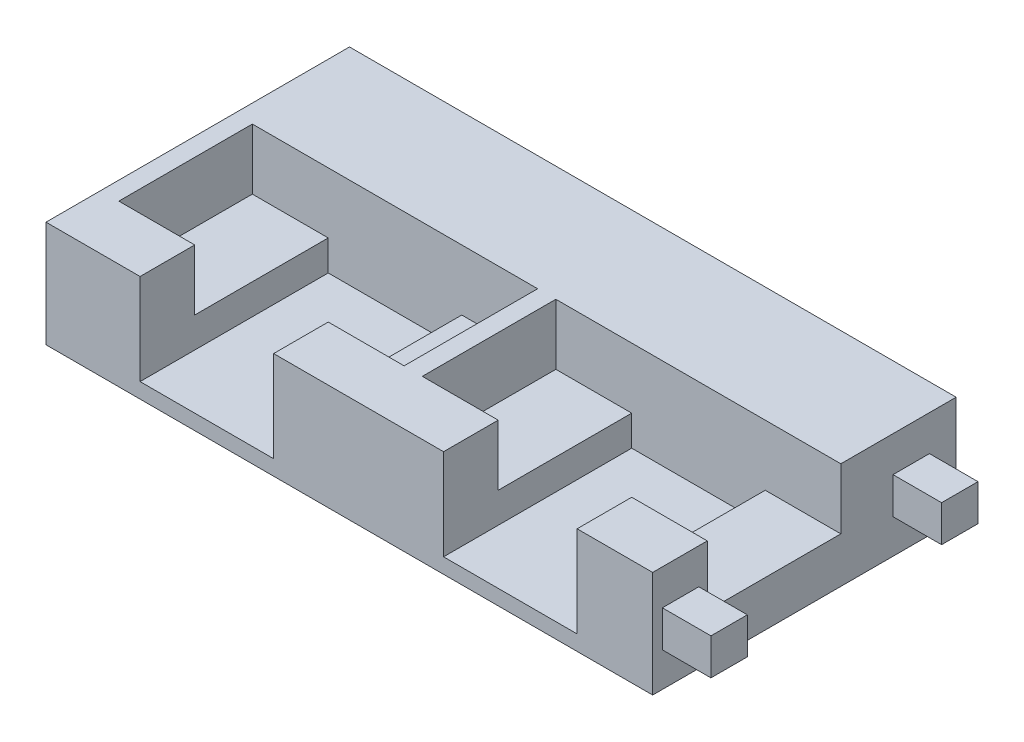
ISO-10303-21;
HEADER;
FILE_DESCRIPTION(('STEP AP214'),'2;1');
FILE_NAME('part.step','',(''),(''),'','','');
FILE_SCHEMA(('AUTOMOTIVE_DESIGN { 1 0 10303 214 1 1 1 1 }'));
ENDSEC;
DATA;
#1=APPLICATION_CONTEXT('core data for automotive mechanical design processes');
#2=APPLICATION_PROTOCOL_DEFINITION('international standard','automotive_design',2000,#1);
#3=PRODUCT_CONTEXT('',#1,'mechanical');
#4=PRODUCT('Part','Part','',(#3));
#5=PRODUCT_RELATED_PRODUCT_CATEGORY('part','',(#4));
#6=PRODUCT_DEFINITION_FORMATION('','',#4);
#7=PRODUCT_DEFINITION_CONTEXT('part definition',#1,'design');
#8=PRODUCT_DEFINITION('design','',#6,#7);
#9=PRODUCT_DEFINITION_SHAPE('','',#8);
#10=(LENGTH_UNIT() NAMED_UNIT(*) SI_UNIT(.MILLI.,.METRE.));
#11=(NAMED_UNIT(*) PLANE_ANGLE_UNIT() SI_UNIT($,.RADIAN.));
#12=(NAMED_UNIT(*) SI_UNIT($,.STERADIAN.) SOLID_ANGLE_UNIT());
#13=UNCERTAINTY_MEASURE_WITH_UNIT(LENGTH_MEASURE(1.E-05),#10,'distance_accuracy_value','');
#14=(GEOMETRIC_REPRESENTATION_CONTEXT(3) GLOBAL_UNCERTAINTY_ASSIGNED_CONTEXT((#13)) GLOBAL_UNIT_ASSIGNED_CONTEXT((#10,
#11,#12)) REPRESENTATION_CONTEXT('',''));
#15=CARTESIAN_POINT('',(0.,0.,0.));
#16=DIRECTION('',(0.,0.,1.));
#17=DIRECTION('',(1.,0.,0.));
#18=AXIS2_PLACEMENT_3D('',#15,#16,#17);
#19=CARTESIAN_POINT('',(108.05,11.75,33.5));
#20=DIRECTION('',(0.,0.,-1.));
#21=DIRECTION('',(-1.,0.,0.));
#22=AXIS2_PLACEMENT_3D('',#19,#20,#21);
#23=PLANE('',#22);
#24=DIRECTION('',(0.,-1.,0.));
#25=VECTOR('',#24,1.);
#26=CARTESIAN_POINT('',(100.05,11.75,33.5));
#27=LINE('',#26,#25);
#28=CARTESIAN_POINT('',(100.05,11.75,33.5));
#29=VERTEX_POINT('',#28);
#30=CARTESIAN_POINT('',(100.05,5.75,33.5));
#31=VERTEX_POINT('',#30);
#32=EDGE_CURVE('E110',#29,#31,#27,.T.);
#33=ORIENTED_EDGE('',*,*,#32,.T.);
#34=DIRECTION('',(-1.,0.,0.));
#35=VECTOR('',#34,1.);
#36=CARTESIAN_POINT('',(108.05,5.75,33.5));
#37=LINE('',#36,#35);
#38=CARTESIAN_POINT('',(108.05,5.75,33.5));
#39=VERTEX_POINT('',#38);
#40=EDGE_CURVE('E12',#39,#31,#37,.T.);
#41=ORIENTED_EDGE('',*,*,#40,.F.);
#42=DIRECTION('',(0.,-1.,0.));
#43=VECTOR('',#42,1.);
#44=CARTESIAN_POINT('',(108.05,11.75,33.5));
#45=LINE('',#44,#43);
#46=CARTESIAN_POINT('',(108.05,11.75,33.5));
#47=VERTEX_POINT('',#46);
#48=EDGE_CURVE('E98',#47,#39,#45,.T.);
#49=ORIENTED_EDGE('',*,*,#48,.F.);
#50=DIRECTION('',(-1.,0.,0.));
#51=VECTOR('',#50,1.);
#52=CARTESIAN_POINT('',(108.05,11.75,33.5));
#53=LINE('',#52,#51);
#54=EDGE_CURVE('E106',#47,#29,#53,.T.);
#55=ORIENTED_EDGE('',*,*,#54,.T.);
#56=EDGE_LOOP('',(#33,#41,#49,#55));
#57=FACE_BOUND('',#56,.T.);
#58=ADVANCED_FACE('F47',(#57),#23,.F.);
#59=CARTESIAN_POINT('',(108.05,5.75,33.5));
#60=DIRECTION('',(0.,1.,0.));
#61=DIRECTION('',(0.,0.,1.));
#62=AXIS2_PLACEMENT_3D('',#59,#60,#61);
#63=PLANE('',#62);
#64=DIRECTION('',(0.,0.,-1.));
#65=VECTOR('',#64,1.);
#66=CARTESIAN_POINT('',(100.05,5.75,33.5));
#67=LINE('',#66,#65);
#68=CARTESIAN_POINT('',(100.05,5.75,27.5));
#69=VERTEX_POINT('',#68);
#70=EDGE_CURVE('E102',#31,#69,#67,.T.);
#71=ORIENTED_EDGE('',*,*,#70,.T.);
#72=DIRECTION('',(-1.,0.,0.));
#73=VECTOR('',#72,1.);
#74=CARTESIAN_POINT('',(108.05,5.75,27.5));
#75=LINE('',#74,#73);
#76=CARTESIAN_POINT('',(108.05,5.75,27.5));
#77=VERTEX_POINT('',#76);
#78=EDGE_CURVE('E55',#77,#69,#75,.T.);
#79=ORIENTED_EDGE('',*,*,#78,.F.);
#80=DIRECTION('',(0.,0.,-1.));
#81=VECTOR('',#80,1.);
#82=CARTESIAN_POINT('',(108.05,5.75,33.5));
#83=LINE('',#82,#81);
#84=EDGE_CURVE('E93',#39,#77,#83,.T.);
#85=ORIENTED_EDGE('',*,*,#84,.F.);
#86=ORIENTED_EDGE('',*,*,#40,.T.);
#87=EDGE_LOOP('',(#71,#79,#85,#86));
#88=FACE_BOUND('',#87,.T.);
#89=ADVANCED_FACE('F101',(#88),#63,.F.);
#90=CARTESIAN_POINT('',(108.05,11.75,27.5));
#91=DIRECTION('',(0.,0.,1.));
#92=DIRECTION('',(1.,0.,0.));
#93=AXIS2_PLACEMENT_3D('',#90,#91,#92);
#94=PLANE('',#93);
#95=DIRECTION('',(0.,1.,0.));
#96=VECTOR('',#95,1.);
#97=CARTESIAN_POINT('',(100.05,11.75,27.5));
#98=LINE('',#97,#96);
#99=CARTESIAN_POINT('',(100.05,11.75,27.5));
#100=VERTEX_POINT('',#99);
#101=EDGE_CURVE('E80',#69,#100,#98,.T.);
#102=ORIENTED_EDGE('',*,*,#101,.T.);
#103=DIRECTION('',(-1.,0.,0.));
#104=VECTOR('',#103,1.);
#105=CARTESIAN_POINT('',(108.05,11.75,27.5));
#106=LINE('',#105,#104);
#107=CARTESIAN_POINT('',(108.05,11.75,27.5));
#108=VERTEX_POINT('',#107);
#109=EDGE_CURVE('E103',#108,#100,#106,.T.);
#110=ORIENTED_EDGE('',*,*,#109,.F.);
#111=DIRECTION('',(0.,1.,0.));
#112=VECTOR('',#111,1.);
#113=CARTESIAN_POINT('',(108.05,11.75,27.5));
#114=LINE('',#113,#112);
#115=EDGE_CURVE('E96',#77,#108,#114,.T.);
#116=ORIENTED_EDGE('',*,*,#115,.F.);
#117=ORIENTED_EDGE('',*,*,#78,.T.);
#118=EDGE_LOOP('',(#102,#110,#116,#117));
#119=FACE_BOUND('',#118,.T.);
#120=ADVANCED_FACE('F104',(#119),#94,.F.);
#121=CARTESIAN_POINT('',(108.05,11.75,33.5));
#122=DIRECTION('',(0.,-1.,0.));
#123=DIRECTION('',(0.,0.,-1.));
#124=AXIS2_PLACEMENT_3D('',#121,#122,#123);
#125=PLANE('',#124);
#126=DIRECTION('',(0.,0.,1.));
#127=VECTOR('',#126,1.);
#128=CARTESIAN_POINT('',(100.05,11.75,33.5));
#129=LINE('',#128,#127);
#130=EDGE_CURVE('E86',#100,#29,#129,.T.);
#131=ORIENTED_EDGE('',*,*,#130,.T.);
#132=ORIENTED_EDGE('',*,*,#54,.F.);
#133=DIRECTION('',(0.,0.,1.));
#134=VECTOR('',#133,1.);
#135=CARTESIAN_POINT('',(108.05,11.75,33.5));
#136=LINE('',#135,#134);
#137=EDGE_CURVE('E63',#108,#47,#136,.T.);
#138=ORIENTED_EDGE('',*,*,#137,.F.);
#139=ORIENTED_EDGE('',*,*,#109,.T.);
#140=EDGE_LOOP('',(#131,#132,#138,#139));
#141=FACE_BOUND('',#140,.T.);
#142=ADVANCED_FACE('F117',(#141),#125,.F.);
#143=CARTESIAN_POINT('',(108.05,0.,0.));
#144=DIRECTION('',(1.,0.,0.));
#145=DIRECTION('',(0.,0.,-1.));
#146=AXIS2_PLACEMENT_3D('',#143,#144,#145);
#147=PLANE('',#146);
#148=ORIENTED_EDGE('',*,*,#48,.T.);
#149=ORIENTED_EDGE('',*,*,#84,.T.);
#150=ORIENTED_EDGE('',*,*,#115,.T.);
#151=ORIENTED_EDGE('',*,*,#137,.T.);
#152=EDGE_LOOP('',(#148,#149,#150,#151));
#153=FACE_BOUND('',#152,.T.);
#154=ADVANCED_FACE('F94',(#153),#147,.T.);
#155=CARTESIAN_POINT('',(100.05,0.,0.));
#156=DIRECTION('',(1.,0.,0.));
#157=DIRECTION('',(0.,0.,-1.));
#158=AXIS2_PLACEMENT_3D('',#155,#156,#157);
#159=PLANE('',#158);
#160=ORIENTED_EDGE('',*,*,#32,.F.);
#161=ORIENTED_EDGE('',*,*,#130,.F.);
#162=ORIENTED_EDGE('',*,*,#101,.F.);
#163=ORIENTED_EDGE('',*,*,#70,.F.);
#164=EDGE_LOOP('',(#160,#161,#162,#163));
#165=FACE_BOUND('',#164,.T.);
#166=ADVANCED_FACE('F120',(#165),#159,.F.);
#167=CLOSED_SHELL('',(#58,#89,#120,#142,#154,#166));
#168=MANIFOLD_SOLID_BREP('B2',#167);
#169=CARTESIAN_POINT('',(108.05,11.75,-4.5));
#170=DIRECTION('',(0.,0.,-1.));
#171=DIRECTION('',(-1.,0.,0.));
#172=AXIS2_PLACEMENT_3D('',#169,#170,#171);
#173=PLANE('',#172);
#174=DIRECTION('',(0.,-1.,0.));
#175=VECTOR('',#174,1.);
#176=CARTESIAN_POINT('',(100.05,11.75,-4.5));
#177=LINE('',#176,#175);
#178=CARTESIAN_POINT('',(100.05,11.75,-4.5));
#179=VERTEX_POINT('',#178);
#180=CARTESIAN_POINT('',(100.05,5.75,-4.5));
#181=VERTEX_POINT('',#180);
#182=EDGE_CURVE('E242',#179,#181,#177,.T.);
#183=ORIENTED_EDGE('',*,*,#182,.T.);
#184=DIRECTION('',(-1.,0.,0.));
#185=VECTOR('',#184,1.);
#186=CARTESIAN_POINT('',(108.05,5.75,-4.5));
#187=LINE('',#186,#185);
#188=CARTESIAN_POINT('',(108.05,5.75,-4.5));
#189=VERTEX_POINT('',#188);
#190=EDGE_CURVE('E45',#189,#181,#187,.T.);
#191=ORIENTED_EDGE('',*,*,#190,.F.);
#192=DIRECTION('',(0.,-1.,0.));
#193=VECTOR('',#192,1.);
#194=CARTESIAN_POINT('',(108.05,11.75,-4.5));
#195=LINE('',#194,#193);
#196=CARTESIAN_POINT('',(108.05,11.75,-4.5));
#197=VERTEX_POINT('',#196);
#198=EDGE_CURVE('E230',#197,#189,#195,.T.);
#199=ORIENTED_EDGE('',*,*,#198,.F.);
#200=DIRECTION('',(-1.,0.,0.));
#201=VECTOR('',#200,1.);
#202=CARTESIAN_POINT('',(108.05,11.75,-4.5));
#203=LINE('',#202,#201);
#204=EDGE_CURVE('E238',#197,#179,#203,.T.);
#205=ORIENTED_EDGE('',*,*,#204,.T.);
#206=EDGE_LOOP('',(#183,#191,#199,#205));
#207=FACE_BOUND('',#206,.T.);
#208=ADVANCED_FACE('F179',(#207),#173,.F.);
#209=CARTESIAN_POINT('',(108.05,5.75,-4.5));
#210=DIRECTION('',(0.,1.,0.));
#211=DIRECTION('',(0.,0.,1.));
#212=AXIS2_PLACEMENT_3D('',#209,#210,#211);
#213=PLANE('',#212);
#214=DIRECTION('',(0.,0.,-1.));
#215=VECTOR('',#214,1.);
#216=CARTESIAN_POINT('',(100.05,5.75,-4.5));
#217=LINE('',#216,#215);
#218=CARTESIAN_POINT('',(100.05,5.75,-10.5));
#219=VERTEX_POINT('',#218);
#220=EDGE_CURVE('E234',#181,#219,#217,.T.);
#221=ORIENTED_EDGE('',*,*,#220,.T.);
#222=DIRECTION('',(-1.,0.,0.));
#223=VECTOR('',#222,1.);
#224=CARTESIAN_POINT('',(108.05,5.75,-10.5));
#225=LINE('',#224,#223);
#226=CARTESIAN_POINT('',(108.05,5.75,-10.5));
#227=VERTEX_POINT('',#226);
#228=EDGE_CURVE('E187',#227,#219,#225,.T.);
#229=ORIENTED_EDGE('',*,*,#228,.F.);
#230=DIRECTION('',(0.,0.,-1.));
#231=VECTOR('',#230,1.);
#232=CARTESIAN_POINT('',(108.05,5.75,-4.5));
#233=LINE('',#232,#231);
#234=EDGE_CURVE('E225',#189,#227,#233,.T.);
#235=ORIENTED_EDGE('',*,*,#234,.F.);
#236=ORIENTED_EDGE('',*,*,#190,.T.);
#237=EDGE_LOOP('',(#221,#229,#235,#236));
#238=FACE_BOUND('',#237,.T.);
#239=ADVANCED_FACE('F233',(#238),#213,.F.);
#240=CARTESIAN_POINT('',(108.05,11.75,-10.5));
#241=DIRECTION('',(0.,0.,1.));
#242=DIRECTION('',(1.,0.,0.));
#243=AXIS2_PLACEMENT_3D('',#240,#241,#242);
#244=PLANE('',#243);
#245=DIRECTION('',(0.,1.,0.));
#246=VECTOR('',#245,1.);
#247=CARTESIAN_POINT('',(100.05,11.75,-10.5));
#248=LINE('',#247,#246);
#249=CARTESIAN_POINT('',(100.05,11.75,-10.5));
#250=VERTEX_POINT('',#249);
#251=EDGE_CURVE('E212',#219,#250,#248,.T.);
#252=ORIENTED_EDGE('',*,*,#251,.T.);
#253=DIRECTION('',(-1.,0.,0.));
#254=VECTOR('',#253,1.);
#255=CARTESIAN_POINT('',(108.05,11.75,-10.5));
#256=LINE('',#255,#254);
#257=CARTESIAN_POINT('',(108.05,11.75,-10.5));
#258=VERTEX_POINT('',#257);
#259=EDGE_CURVE('E235',#258,#250,#256,.T.);
#260=ORIENTED_EDGE('',*,*,#259,.F.);
#261=DIRECTION('',(0.,1.,0.));
#262=VECTOR('',#261,1.);
#263=CARTESIAN_POINT('',(108.05,11.75,-10.5));
#264=LINE('',#263,#262);
#265=EDGE_CURVE('E228',#227,#258,#264,.T.);
#266=ORIENTED_EDGE('',*,*,#265,.F.);
#267=ORIENTED_EDGE('',*,*,#228,.T.);
#268=EDGE_LOOP('',(#252,#260,#266,#267));
#269=FACE_BOUND('',#268,.T.);
#270=ADVANCED_FACE('F236',(#269),#244,.F.);
#271=CARTESIAN_POINT('',(108.05,11.75,-4.5));
#272=DIRECTION('',(0.,-1.,0.));
#273=DIRECTION('',(0.,0.,-1.));
#274=AXIS2_PLACEMENT_3D('',#271,#272,#273);
#275=PLANE('',#274);
#276=DIRECTION('',(0.,0.,1.));
#277=VECTOR('',#276,1.);
#278=CARTESIAN_POINT('',(100.05,11.75,-4.5));
#279=LINE('',#278,#277);
#280=EDGE_CURVE('E218',#250,#179,#279,.T.);
#281=ORIENTED_EDGE('',*,*,#280,.T.);
#282=ORIENTED_EDGE('',*,*,#204,.F.);
#283=DIRECTION('',(0.,0.,1.));
#284=VECTOR('',#283,1.);
#285=CARTESIAN_POINT('',(108.05,11.75,-4.5));
#286=LINE('',#285,#284);
#287=EDGE_CURVE('E195',#258,#197,#286,.T.);
#288=ORIENTED_EDGE('',*,*,#287,.F.);
#289=ORIENTED_EDGE('',*,*,#259,.T.);
#290=EDGE_LOOP('',(#281,#282,#288,#289));
#291=FACE_BOUND('',#290,.T.);
#292=ADVANCED_FACE('F249',(#291),#275,.F.);
#293=CARTESIAN_POINT('',(108.05,0.,0.));
#294=DIRECTION('',(1.,0.,0.));
#295=DIRECTION('',(0.,0.,-1.));
#296=AXIS2_PLACEMENT_3D('',#293,#294,#295);
#297=PLANE('',#296);
#298=ORIENTED_EDGE('',*,*,#198,.T.);
#299=ORIENTED_EDGE('',*,*,#234,.T.);
#300=ORIENTED_EDGE('',*,*,#265,.T.);
#301=ORIENTED_EDGE('',*,*,#287,.T.);
#302=EDGE_LOOP('',(#298,#299,#300,#301));
#303=FACE_BOUND('',#302,.T.);
#304=ADVANCED_FACE('F226',(#303),#297,.T.);
#305=CARTESIAN_POINT('',(100.05,0.,0.));
#306=DIRECTION('',(1.,0.,0.));
#307=DIRECTION('',(0.,0.,-1.));
#308=AXIS2_PLACEMENT_3D('',#305,#306,#307);
#309=PLANE('',#308);
#310=ORIENTED_EDGE('',*,*,#182,.F.);
#311=ORIENTED_EDGE('',*,*,#280,.F.);
#312=ORIENTED_EDGE('',*,*,#251,.F.);
#313=ORIENTED_EDGE('',*,*,#220,.F.);
#314=EDGE_LOOP('',(#310,#311,#312,#313));
#315=FACE_BOUND('',#314,.T.);
#316=ADVANCED_FACE('F252',(#315),#309,.F.);
#317=CLOSED_SHELL('',(#208,#239,#270,#292,#304,#316));
#318=MANIFOLD_SOLID_BREP('B6',#317);
#319=CARTESIAN_POINT('',(0.,17.5,-15.));
#320=DIRECTION('',(0.,0.,-1.));
#321=DIRECTION('',(-1.,0.,0.));
#322=AXIS2_PLACEMENT_3D('',#319,#320,#321);
#323=PLANE('',#322);
#324=DIRECTION('',(1.,0.,0.));
#325=VECTOR('',#324,1.);
#326=CARTESIAN_POINT('',(0.,17.5,-15.));
#327=LINE('',#326,#325);
#328=CARTESIAN_POINT('',(0.,17.5,-15.));
#329=VERTEX_POINT('',#328);
#330=CARTESIAN_POINT('',(99.95,17.5,-15.));
#331=VERTEX_POINT('',#330);
#332=EDGE_CURVE('E380',#329,#331,#327,.T.);
#333=ORIENTED_EDGE('',*,*,#332,.T.);
#334=DIRECTION('',(0.,1.,0.));
#335=VECTOR('',#334,1.);
#336=CARTESIAN_POINT('',(99.95,18.,-15.));
#337=LINE('',#336,#335);
#338=CARTESIAN_POINT('',(99.95,0.,-15.));
#339=VERTEX_POINT('',#338);
#340=EDGE_CURVE('E688',#339,#331,#337,.T.);
#341=ORIENTED_EDGE('',*,*,#340,.F.);
#342=DIRECTION('',(1.,0.,0.));
#343=VECTOR('',#342,1.);
#344=CARTESIAN_POINT('',(0.,0.,-15.));
#345=LINE('',#344,#343);
#346=CARTESIAN_POINT('',(0.,0.,-15.));
#347=VERTEX_POINT('',#346);
#348=EDGE_CURVE('E389',#347,#339,#345,.T.);
#349=ORIENTED_EDGE('',*,*,#348,.F.);
#350=DIRECTION('',(0.,-1.,0.));
#351=VECTOR('',#350,1.);
#352=CARTESIAN_POINT('',(0.,17.5,-15.));
#353=LINE('',#352,#351);
#354=EDGE_CURVE('E384',#329,#347,#353,.T.);
#355=ORIENTED_EDGE('',*,*,#354,.F.);
#356=EDGE_LOOP('',(#333,#341,#349,#355));
#357=FACE_BOUND('',#356,.T.);
#358=ADVANCED_FACE('F302',(#357),#323,.T.);
#359=CARTESIAN_POINT('',(0.,0.,0.));
#360=DIRECTION('',(0.,1.,0.));
#361=DIRECTION('',(0.,0.,1.));
#362=AXIS2_PLACEMENT_3D('',#359,#360,#361);
#363=PLANE('',#362);
#364=DIRECTION('',(0.,0.,-1.));
#365=VECTOR('',#364,1.);
#366=CARTESIAN_POINT('',(99.95,0.,35.));
#367=LINE('',#366,#365);
#368=CARTESIAN_POINT('',(99.95,0.,35.));
#369=VERTEX_POINT('',#368);
#370=EDGE_CURVE('E690',#369,#339,#367,.T.);
#371=ORIENTED_EDGE('',*,*,#370,.F.);
#372=DIRECTION('',(1.,0.,0.));
#373=VECTOR('',#372,1.);
#374=CARTESIAN_POINT('',(0.,0.,35.));
#375=LINE('',#374,#373);
#376=CARTESIAN_POINT('',(0.,0.,35.));
#377=VERTEX_POINT('',#376);
#378=EDGE_CURVE('E391',#377,#369,#375,.T.);
#379=ORIENTED_EDGE('',*,*,#378,.F.);
#380=DIRECTION('',(0.,0.,1.));
#381=VECTOR('',#380,1.);
#382=CARTESIAN_POINT('',(0.,0.,-15.));
#383=LINE('',#382,#381);
#384=EDGE_CURVE('E394',#347,#377,#383,.T.);
#385=ORIENTED_EDGE('',*,*,#384,.F.);
#386=ORIENTED_EDGE('',*,*,#348,.T.);
#387=EDGE_LOOP('',(#371,#379,#385,#386));
#388=FACE_BOUND('',#387,.T.);
#389=ADVANCED_FACE('F304',(#388),#363,.F.);
#390=CARTESIAN_POINT('',(0.,17.5,35.));
#391=DIRECTION('',(0.,0.,-1.));
#392=DIRECTION('',(-1.,0.,0.));
#393=AXIS2_PLACEMENT_3D('',#390,#391,#392);
#394=PLANE('',#393);
#395=DIRECTION('',(0.,-1.,0.));
#396=VECTOR('',#395,1.);
#397=CARTESIAN_POINT('',(99.95,17.5,35.));
#398=LINE('',#397,#396);
#399=CARTESIAN_POINT('',(99.95,17.5,35.));
#400=VERTEX_POINT('',#399);
#401=EDGE_CURVE('E177',#400,#369,#398,.T.);
#402=ORIENTED_EDGE('',*,*,#401,.F.);
#403=DIRECTION('',(1.,0.,0.));
#404=VECTOR('',#403,1.);
#405=CARTESIAN_POINT('',(0.,17.5,35.));
#406=LINE('',#405,#404);
#407=CARTESIAN_POINT('',(87.5,17.5,35.));
#408=VERTEX_POINT('',#407);
#409=EDGE_CURVE('E388',#408,#400,#406,.T.);
#410=ORIENTED_EDGE('',*,*,#409,.F.);
#411=DIRECTION('',(0.,1.,0.));
#412=VECTOR('',#411,1.);
#413=CARTESIAN_POINT('',(87.5,2.5,35.));
#414=LINE('',#413,#412);
#415=CARTESIAN_POINT('',(87.5,2.5,35.));
#416=VERTEX_POINT('',#415);
#417=EDGE_CURVE('E518',#416,#408,#414,.T.);
#418=ORIENTED_EDGE('',*,*,#417,.F.);
#419=DIRECTION('',(-1.,0.,0.));
#420=VECTOR('',#419,1.);
#421=CARTESIAN_POINT('',(87.5,2.5,35.));
#422=LINE('',#421,#420);
#423=CARTESIAN_POINT('',(65.5,2.5,35.));
#424=VERTEX_POINT('',#423);
#425=EDGE_CURVE('E362',#416,#424,#422,.T.);
#426=ORIENTED_EDGE('',*,*,#425,.T.);
#427=DIRECTION('',(0.,1.,0.));
#428=VECTOR('',#427,1.);
#429=CARTESIAN_POINT('',(65.5,2.5,35.));
#430=LINE('',#429,#428);
#431=CARTESIAN_POINT('',(65.5,17.5,35.));
#432=VERTEX_POINT('',#431);
#433=EDGE_CURVE('E521',#424,#432,#430,.T.);
#434=ORIENTED_EDGE('',*,*,#433,.T.);
#435=CARTESIAN_POINT('',(37.5,17.5,35.));
#436=VERTEX_POINT('',#435);
#437=EDGE_CURVE('E387',#436,#432,#406,.T.);
#438=ORIENTED_EDGE('',*,*,#437,.F.);
#439=DIRECTION('',(0.,1.,0.));
#440=VECTOR('',#439,1.);
#441=CARTESIAN_POINT('',(37.5,2.5,35.));
#442=LINE('',#441,#440);
#443=CARTESIAN_POINT('',(37.5,2.5,35.));
#444=VERTEX_POINT('',#443);
#445=EDGE_CURVE('E462',#444,#436,#442,.T.);
#446=ORIENTED_EDGE('',*,*,#445,.F.);
#447=DIRECTION('',(1.,0.,0.));
#448=VECTOR('',#447,1.);
#449=CARTESIAN_POINT('',(15.5,2.5,35.));
#450=LINE('',#449,#448);
#451=CARTESIAN_POINT('',(15.5,2.5,35.));
#452=VERTEX_POINT('',#451);
#453=EDGE_CURVE('E483',#452,#444,#450,.T.);
#454=ORIENTED_EDGE('',*,*,#453,.F.);
#455=DIRECTION('',(0.,1.,0.));
#456=VECTOR('',#455,1.);
#457=CARTESIAN_POINT('',(15.5,2.5,35.));
#458=LINE('',#457,#456);
#459=CARTESIAN_POINT('',(15.5,17.5,35.));
#460=VERTEX_POINT('',#459);
#461=EDGE_CURVE('E458',#452,#460,#458,.T.);
#462=ORIENTED_EDGE('',*,*,#461,.T.);
#463=CARTESIAN_POINT('',(0.,17.5,35.));
#464=VERTEX_POINT('',#463);
#465=EDGE_CURVE('E383',#464,#460,#406,.T.);
#466=ORIENTED_EDGE('',*,*,#465,.F.);
#467=DIRECTION('',(0.,-1.,0.));
#468=VECTOR('',#467,1.);
#469=CARTESIAN_POINT('',(0.,17.5,35.));
#470=LINE('',#469,#468);
#471=EDGE_CURVE('E679',#464,#377,#470,.T.);
#472=ORIENTED_EDGE('',*,*,#471,.T.);
#473=ORIENTED_EDGE('',*,*,#378,.T.);
#474=EDGE_LOOP('',(#402,#410,#418,#426,#434,#438,#446,#454,#462,#466,#472,#473));
#475=FACE_BOUND('',#474,.T.);
#476=ADVANCED_FACE('F526',(#475),#394,.F.);
#477=CARTESIAN_POINT('',(0.,7.5,0.));
#478=DIRECTION('',(0.,1.,0.));
#479=DIRECTION('',(0.,0.,1.));
#480=AXIS2_PLACEMENT_3D('',#477,#478,#479);
#481=PLANE('',#480);
#482=DIRECTION('',(0.,0.,1.));
#483=VECTOR('',#482,1.);
#484=CARTESIAN_POINT('',(15.5,7.5,0.));
#485=LINE('',#484,#483);
#486=CARTESIAN_POINT('',(15.5,7.5,4.));
#487=VERTEX_POINT('',#486);
#488=CARTESIAN_POINT('',(15.5,7.5,26.));
#489=VERTEX_POINT('',#488);
#490=EDGE_CURVE('E648',#487,#489,#485,.T.);
#491=ORIENTED_EDGE('',*,*,#490,.F.);
#492=DIRECTION('',(-1.,0.,0.));
#493=VECTOR('',#492,1.);
#494=CARTESIAN_POINT('',(3.,7.5,4.));
#495=LINE('',#494,#493);
#496=CARTESIAN_POINT('',(3.,7.5,4.));
#497=VERTEX_POINT('',#496);
#498=EDGE_CURVE('E442',#487,#497,#495,.T.);
#499=ORIENTED_EDGE('',*,*,#498,.T.);
#500=DIRECTION('',(0.,0.,1.));
#501=VECTOR('',#500,1.);
#502=CARTESIAN_POINT('',(3.,7.5,4.));
#503=LINE('',#502,#501);
#504=CARTESIAN_POINT('',(3.,7.5,26.));
#505=VERTEX_POINT('',#504);
#506=EDGE_CURVE('E429',#497,#505,#503,.T.);
#507=ORIENTED_EDGE('',*,*,#506,.T.);
#508=DIRECTION('',(1.,0.,0.));
#509=VECTOR('',#508,1.);
#510=CARTESIAN_POINT('',(3.,7.5,26.));
#511=LINE('',#510,#509);
#512=EDGE_CURVE('E446',#505,#489,#511,.T.);
#513=ORIENTED_EDGE('',*,*,#512,.T.);
#514=EDGE_LOOP('',(#491,#499,#507,#513));
#515=FACE_BOUND('',#514,.T.);
#516=ADVANCED_FACE('F704',(#515),#481,.T.);
#517=DIRECTION('',(0.,0.,-1.));
#518=VECTOR('',#517,1.);
#519=CARTESIAN_POINT('',(37.5,7.5,0.));
#520=LINE('',#519,#518);
#521=CARTESIAN_POINT('',(37.5,7.5,26.));
#522=VERTEX_POINT('',#521);
#523=CARTESIAN_POINT('',(37.5,7.5,4.));
#524=VERTEX_POINT('',#523);
#525=EDGE_CURVE('E681',#522,#524,#520,.T.);
#526=ORIENTED_EDGE('',*,*,#525,.F.);
#527=CARTESIAN_POINT('',(50.,7.5,26.));
#528=VERTEX_POINT('',#527);
#529=EDGE_CURVE('E449',#522,#528,#511,.T.);
#530=ORIENTED_EDGE('',*,*,#529,.T.);
#531=DIRECTION('',(0.,0.,-1.));
#532=VECTOR('',#531,1.);
#533=CARTESIAN_POINT('',(50.,7.5,4.));
#534=LINE('',#533,#532);
#535=CARTESIAN_POINT('',(50.,7.5,4.));
#536=VERTEX_POINT('',#535);
#537=EDGE_CURVE('E443',#528,#536,#534,.T.);
#538=ORIENTED_EDGE('',*,*,#537,.T.);
#539=EDGE_CURVE('E419',#536,#524,#495,.T.);
#540=ORIENTED_EDGE('',*,*,#539,.T.);
#541=EDGE_LOOP('',(#526,#530,#538,#540));
#542=FACE_BOUND('',#541,.T.);
#543=ADVANCED_FACE('F726',(#542),#481,.T.);
#544=CARTESIAN_POINT('',(53.,7.5,4.));
#545=DIRECTION('',(1.,0.,0.));
#546=DIRECTION('',(0.,0.,-1.));
#547=AXIS2_PLACEMENT_3D('',#544,#545,#546);
#548=PLANE('',#547);
#549=DIRECTION('',(0.,0.,-1.));
#550=VECTOR('',#549,1.);
#551=CARTESIAN_POINT('',(53.,17.5,4.));
#552=LINE('',#551,#550);
#553=CARTESIAN_POINT('',(53.,17.5,26.));
#554=VERTEX_POINT('',#553);
#555=CARTESIAN_POINT('',(53.,17.5,4.));
#556=VERTEX_POINT('',#555);
#557=EDGE_CURVE('E499',#554,#556,#552,.T.);
#558=ORIENTED_EDGE('',*,*,#557,.F.);
#559=DIRECTION('',(0.,1.,0.));
#560=VECTOR('',#559,1.);
#561=CARTESIAN_POINT('',(53.,7.5,26.));
#562=LINE('',#561,#560);
#563=CARTESIAN_POINT('',(53.,7.5,26.));
#564=VERTEX_POINT('',#563);
#565=EDGE_CURVE('E477',#564,#554,#562,.T.);
#566=ORIENTED_EDGE('',*,*,#565,.F.);
#567=DIRECTION('',(0.,0.,-1.));
#568=VECTOR('',#567,1.);
#569=CARTESIAN_POINT('',(53.,7.5,4.));
#570=LINE('',#569,#568);
#571=CARTESIAN_POINT('',(53.,7.5,4.));
#572=VERTEX_POINT('',#571);
#573=EDGE_CURVE('E509',#564,#572,#570,.T.);
#574=ORIENTED_EDGE('',*,*,#573,.T.);
#575=DIRECTION('',(0.,1.,0.));
#576=VECTOR('',#575,1.);
#577=CARTESIAN_POINT('',(53.,7.5,4.));
#578=LINE('',#577,#576);
#579=EDGE_CURVE('E488',#572,#556,#578,.T.);
#580=ORIENTED_EDGE('',*,*,#579,.T.);
#581=EDGE_LOOP('',(#558,#566,#574,#580));
#582=FACE_BOUND('',#581,.T.);
#583=ADVANCED_FACE('F654',(#582),#548,.T.);
#584=CARTESIAN_POINT('',(3.,7.5,26.));
#585=DIRECTION('',(0.,0.,1.));
#586=DIRECTION('',(1.,0.,0.));
#587=AXIS2_PLACEMENT_3D('',#584,#585,#586);
#588=PLANE('',#587);
#589=ORIENTED_EDGE('',*,*,#529,.F.);
#590=DIRECTION('',(0.,1.,0.));
#591=VECTOR('',#590,1.);
#592=CARTESIAN_POINT('',(37.5,7.5,26.));
#593=LINE('',#592,#591);
#594=CARTESIAN_POINT('',(37.5,17.5,26.));
#595=VERTEX_POINT('',#594);
#596=EDGE_CURVE('E454',#522,#595,#593,.T.);
#597=ORIENTED_EDGE('',*,*,#596,.T.);
#598=DIRECTION('',(1.,0.,0.));
#599=VECTOR('',#598,1.);
#600=CARTESIAN_POINT('',(3.,17.5,26.));
#601=LINE('',#600,#599);
#602=CARTESIAN_POINT('',(50.,17.5,26.));
#603=VERTEX_POINT('',#602);
#604=EDGE_CURVE('E435',#595,#603,#601,.T.);
#605=ORIENTED_EDGE('',*,*,#604,.T.);
#606=DIRECTION('',(0.,1.,0.));
#607=VECTOR('',#606,1.);
#608=CARTESIAN_POINT('',(50.,7.5,26.));
#609=LINE('',#608,#607);
#610=EDGE_CURVE('E420',#528,#603,#609,.T.);
#611=ORIENTED_EDGE('',*,*,#610,.F.);
#612=EDGE_LOOP('',(#589,#597,#605,#611));
#613=FACE_BOUND('',#612,.T.);
#614=ADVANCED_FACE('F725',(#613),#588,.F.);
#615=CARTESIAN_POINT('',(50.,7.5,4.));
#616=DIRECTION('',(1.,0.,0.));
#617=DIRECTION('',(0.,0.,-1.));
#618=AXIS2_PLACEMENT_3D('',#615,#616,#617);
#619=PLANE('',#618);
#620=DIRECTION('',(0.,0.,-1.));
#621=VECTOR('',#620,1.);
#622=CARTESIAN_POINT('',(50.,17.5,4.));
#623=LINE('',#622,#621);
#624=CARTESIAN_POINT('',(50.,17.5,4.));
#625=VERTEX_POINT('',#624);
#626=EDGE_CURVE('E428',#603,#625,#623,.T.);
#627=ORIENTED_EDGE('',*,*,#626,.T.);
#628=DIRECTION('',(0.,1.,0.));
#629=VECTOR('',#628,1.);
#630=CARTESIAN_POINT('',(50.,7.5,4.));
#631=LINE('',#630,#629);
#632=EDGE_CURVE('E409',#536,#625,#631,.T.);
#633=ORIENTED_EDGE('',*,*,#632,.F.);
#634=ORIENTED_EDGE('',*,*,#537,.F.);
#635=ORIENTED_EDGE('',*,*,#610,.T.);
#636=EDGE_LOOP('',(#627,#633,#634,#635));
#637=FACE_BOUND('',#636,.T.);
#638=ADVANCED_FACE('F742',(#637),#619,.F.);
#639=CARTESIAN_POINT('',(3.,7.5,4.));
#640=DIRECTION('',(0.,0.,-1.));
#641=DIRECTION('',(-1.,0.,0.));
#642=AXIS2_PLACEMENT_3D('',#639,#640,#641);
#643=PLANE('',#642);
#644=DIRECTION('',(-1.,0.,0.));
#645=VECTOR('',#644,1.);
#646=CARTESIAN_POINT('',(3.,17.5,4.));
#647=LINE('',#646,#645);
#648=CARTESIAN_POINT('',(3.,17.5,4.));
#649=VERTEX_POINT('',#648);
#650=EDGE_CURVE('E425',#625,#649,#647,.T.);
#651=ORIENTED_EDGE('',*,*,#650,.T.);
#652=DIRECTION('',(0.,1.,0.));
#653=VECTOR('',#652,1.);
#654=CARTESIAN_POINT('',(3.,7.5,4.));
#655=LINE('',#654,#653);
#656=EDGE_CURVE('E401',#497,#649,#655,.T.);
#657=ORIENTED_EDGE('',*,*,#656,.F.);
#658=ORIENTED_EDGE('',*,*,#498,.F.);
#659=DIRECTION('',(0.,1.,0.));
#660=VECTOR('',#659,1.);
#661=CARTESIAN_POINT('',(15.5,2.5,4.));
#662=LINE('',#661,#660);
#663=CARTESIAN_POINT('',(15.5,2.5,4.));
#664=VERTEX_POINT('',#663);
#665=EDGE_CURVE('E457',#664,#487,#662,.T.);
#666=ORIENTED_EDGE('',*,*,#665,.F.);
#667=DIRECTION('',(-1.,0.,0.));
#668=VECTOR('',#667,1.);
#669=CARTESIAN_POINT('',(15.5,2.5,4.));
#670=LINE('',#669,#668);
#671=CARTESIAN_POINT('',(37.5,2.5,4.));
#672=VERTEX_POINT('',#671);
#673=EDGE_CURVE('E461',#672,#664,#670,.T.);
#674=ORIENTED_EDGE('',*,*,#673,.F.);
#675=DIRECTION('',(0.,1.,0.));
#676=VECTOR('',#675,1.);
#677=CARTESIAN_POINT('',(37.5,2.5,4.));
#678=LINE('',#677,#676);
#679=EDGE_CURVE('E465',#672,#524,#678,.T.);
#680=ORIENTED_EDGE('',*,*,#679,.T.);
#681=ORIENTED_EDGE('',*,*,#539,.F.);
#682=ORIENTED_EDGE('',*,*,#632,.T.);
#683=EDGE_LOOP('',(#651,#657,#658,#666,#674,#680,#681,#682));
#684=FACE_BOUND('',#683,.T.);
#685=ADVANCED_FACE('F738',(#684),#643,.F.);
#686=CARTESIAN_POINT('',(3.,7.5,4.));
#687=DIRECTION('',(-1.,0.,0.));
#688=DIRECTION('',(0.,0.,1.));
#689=AXIS2_PLACEMENT_3D('',#686,#687,#688);
#690=PLANE('',#689);
#691=DIRECTION('',(0.,0.,1.));
#692=VECTOR('',#691,1.);
#693=CARTESIAN_POINT('',(3.,17.5,4.));
#694=LINE('',#693,#692);
#695=CARTESIAN_POINT('',(3.,17.5,26.));
#696=VERTEX_POINT('',#695);
#697=EDGE_CURVE('E436',#649,#696,#694,.T.);
#698=ORIENTED_EDGE('',*,*,#697,.T.);
#699=DIRECTION('',(0.,1.,0.));
#700=VECTOR('',#699,1.);
#701=CARTESIAN_POINT('',(3.,7.5,26.));
#702=LINE('',#701,#700);
#703=EDGE_CURVE('E416',#505,#696,#702,.T.);
#704=ORIENTED_EDGE('',*,*,#703,.F.);
#705=ORIENTED_EDGE('',*,*,#506,.F.);
#706=ORIENTED_EDGE('',*,*,#656,.T.);
#707=EDGE_LOOP('',(#698,#704,#705,#706));
#708=FACE_BOUND('',#707,.T.);
#709=ADVANCED_FACE('F741',(#708),#690,.F.);
#710=CARTESIAN_POINT('',(15.5,17.5,26.));
#711=VERTEX_POINT('',#710);
#712=EDGE_CURVE('E432',#696,#711,#601,.T.);
#713=ORIENTED_EDGE('',*,*,#712,.T.);
#714=DIRECTION('',(0.,-1.,0.));
#715=VECTOR('',#714,1.);
#716=CARTESIAN_POINT('',(15.5,7.5,26.));
#717=LINE('',#716,#715);
#718=EDGE_CURVE('E439',#711,#489,#717,.T.);
#719=ORIENTED_EDGE('',*,*,#718,.T.);
#720=ORIENTED_EDGE('',*,*,#512,.F.);
#721=ORIENTED_EDGE('',*,*,#703,.T.);
#722=EDGE_LOOP('',(#713,#719,#720,#721));
#723=FACE_BOUND('',#722,.T.);
#724=ADVANCED_FACE('F750',(#723),#588,.F.);
#725=CARTESIAN_POINT('',(100.,7.5,26.));
#726=DIRECTION('',(0.,0.,-1.));
#727=DIRECTION('',(-1.,0.,0.));
#728=AXIS2_PLACEMENT_3D('',#725,#726,#727);
#729=PLANE('',#728);
#730=DIRECTION('',(-1.,0.,0.));
#731=VECTOR('',#730,1.);
#732=CARTESIAN_POINT('',(100.,17.5,26.));
#733=LINE('',#732,#731);
#734=CARTESIAN_POINT('',(65.5,17.5,26.));
#735=VERTEX_POINT('',#734);
#736=EDGE_CURVE('E497',#735,#554,#733,.T.);
#737=ORIENTED_EDGE('',*,*,#736,.F.);
#738=DIRECTION('',(0.,-1.,0.));
#739=VECTOR('',#738,1.);
#740=CARTESIAN_POINT('',(65.5,7.5,26.));
#741=LINE('',#740,#739);
#742=CARTESIAN_POINT('',(65.5,7.5,26.));
#743=VERTEX_POINT('',#742);
#744=EDGE_CURVE('E516',#735,#743,#741,.T.);
#745=ORIENTED_EDGE('',*,*,#744,.T.);
#746=DIRECTION('',(-1.,0.,0.));
#747=VECTOR('',#746,1.);
#748=CARTESIAN_POINT('',(100.,7.5,26.));
#749=LINE('',#748,#747);
#750=EDGE_CURVE('E508',#743,#564,#749,.T.);
#751=ORIENTED_EDGE('',*,*,#750,.T.);
#752=ORIENTED_EDGE('',*,*,#565,.T.);
#753=EDGE_LOOP('',(#737,#745,#751,#752));
#754=FACE_BOUND('',#753,.T.);
#755=ADVANCED_FACE('F658',(#754),#729,.T.);
#756=CARTESIAN_POINT('',(103.,7.5,0.));
#757=DIRECTION('',(0.,1.,0.));
#758=DIRECTION('',(0.,0.,1.));
#759=AXIS2_PLACEMENT_3D('',#756,#757,#758);
#760=PLANE('',#759);
#761=ORIENTED_EDGE('',*,*,#750,.F.);
#762=DIRECTION('',(0.,0.,-1.));
#763=VECTOR('',#762,1.);
#764=CARTESIAN_POINT('',(65.5,7.5,0.));
#765=LINE('',#764,#763);
#766=CARTESIAN_POINT('',(65.5,7.5,4.));
#767=VERTEX_POINT('',#766);
#768=EDGE_CURVE('E642',#743,#767,#765,.T.);
#769=ORIENTED_EDGE('',*,*,#768,.T.);
#770=DIRECTION('',(1.,0.,0.));
#771=VECTOR('',#770,1.);
#772=CARTESIAN_POINT('',(100.,7.5,3.99999999999999));
#773=LINE('',#772,#771);
#774=EDGE_CURVE('E512',#572,#767,#773,.T.);
#775=ORIENTED_EDGE('',*,*,#774,.F.);
#776=ORIENTED_EDGE('',*,*,#573,.F.);
#777=EDGE_LOOP('',(#761,#769,#775,#776));
#778=FACE_BOUND('',#777,.T.);
#779=ADVANCED_FACE('F646',(#778),#760,.T.);
#780=DIRECTION('',(0.,1.,0.));
#781=VECTOR('',#780,1.);
#782=CARTESIAN_POINT('',(99.95,7.5,26.));
#783=LINE('',#782,#781);
#784=CARTESIAN_POINT('',(99.95,7.5,26.));
#785=VERTEX_POINT('',#784);
#786=CARTESIAN_POINT('',(99.95,17.5,26.));
#787=VERTEX_POINT('',#786);
#788=EDGE_CURVE('E374',#785,#787,#783,.T.);
#789=ORIENTED_EDGE('',*,*,#788,.F.);
#790=CARTESIAN_POINT('',(87.5,7.5,26.));
#791=VERTEX_POINT('',#790);
#792=EDGE_CURVE('E491',#785,#791,#749,.T.);
#793=ORIENTED_EDGE('',*,*,#792,.T.);
#794=DIRECTION('',(0.,1.,0.));
#795=VECTOR('',#794,1.);
#796=CARTESIAN_POINT('',(87.5,7.5,26.));
#797=LINE('',#796,#795);
#798=CARTESIAN_POINT('',(87.5,17.5,26.));
#799=VERTEX_POINT('',#798);
#800=EDGE_CURVE('E505',#791,#799,#797,.T.);
#801=ORIENTED_EDGE('',*,*,#800,.T.);
#802=EDGE_CURVE('E494',#787,#799,#733,.T.);
#803=ORIENTED_EDGE('',*,*,#802,.F.);
#804=EDGE_LOOP('',(#789,#793,#801,#803));
#805=FACE_BOUND('',#804,.T.);
#806=ADVANCED_FACE('F544',(#805),#729,.T.);
#807=DIRECTION('',(0.,0.,1.));
#808=VECTOR('',#807,1.);
#809=CARTESIAN_POINT('',(99.95,7.5,0.));
#810=LINE('',#809,#808);
#811=CARTESIAN_POINT('',(99.95,7.5,3.99999999999999));
#812=VERTEX_POINT('',#811);
#813=EDGE_CURVE('E311',#812,#785,#810,.T.);
#814=ORIENTED_EDGE('',*,*,#813,.F.);
#815=CARTESIAN_POINT('',(87.5,7.5,3.99999999999999));
#816=VERTEX_POINT('',#815);
#817=EDGE_CURVE('E498',#816,#812,#773,.T.);
#818=ORIENTED_EDGE('',*,*,#817,.F.);
#819=DIRECTION('',(0.,0.,1.));
#820=VECTOR('',#819,1.);
#821=CARTESIAN_POINT('',(87.5,7.5,0.));
#822=LINE('',#821,#820);
#823=EDGE_CURVE('E360',#816,#791,#822,.T.);
#824=ORIENTED_EDGE('',*,*,#823,.T.);
#825=ORIENTED_EDGE('',*,*,#792,.F.);
#826=EDGE_LOOP('',(#814,#818,#824,#825));
#827=FACE_BOUND('',#826,.T.);
#828=ADVANCED_FACE('F717',(#827),#760,.T.);
#829=CARTESIAN_POINT('',(100.,7.5,3.99999999999999));
#830=DIRECTION('',(0.,0.,1.));
#831=DIRECTION('',(1.,0.,0.));
#832=AXIS2_PLACEMENT_3D('',#829,#830,#831);
#833=PLANE('',#832);
#834=DIRECTION('',(0.,-1.,0.));
#835=VECTOR('',#834,1.);
#836=CARTESIAN_POINT('',(99.95,7.5,3.99999999999999));
#837=LINE('',#836,#835);
#838=CARTESIAN_POINT('',(99.95,17.5,3.99999999999999));
#839=VERTEX_POINT('',#838);
#840=EDGE_CURVE('E686',#839,#812,#837,.T.);
#841=ORIENTED_EDGE('',*,*,#840,.F.);
#842=DIRECTION('',(1.,0.,0.));
#843=VECTOR('',#842,1.);
#844=CARTESIAN_POINT('',(100.,17.5,3.99999999999999));
#845=LINE('',#844,#843);
#846=EDGE_CURVE('E502',#556,#839,#845,.T.);
#847=ORIENTED_EDGE('',*,*,#846,.F.);
#848=ORIENTED_EDGE('',*,*,#579,.F.);
#849=ORIENTED_EDGE('',*,*,#774,.T.);
#850=DIRECTION('',(0.,1.,0.));
#851=VECTOR('',#850,1.);
#852=CARTESIAN_POINT('',(65.5,2.5,4.));
#853=LINE('',#852,#851);
#854=CARTESIAN_POINT('',(65.5,2.5,4.));
#855=VERTEX_POINT('',#854);
#856=EDGE_CURVE('E349',#855,#767,#853,.T.);
#857=ORIENTED_EDGE('',*,*,#856,.F.);
#858=DIRECTION('',(1.,0.,0.));
#859=VECTOR('',#858,1.);
#860=CARTESIAN_POINT('',(87.5,2.5,3.99999999999999));
#861=LINE('',#860,#859);
#862=CARTESIAN_POINT('',(87.5,2.5,3.99999999999999));
#863=VERTEX_POINT('',#862);
#864=EDGE_CURVE('E340',#855,#863,#861,.T.);
#865=ORIENTED_EDGE('',*,*,#864,.T.);
#866=DIRECTION('',(0.,1.,0.));
#867=VECTOR('',#866,1.);
#868=CARTESIAN_POINT('',(87.5,2.5,3.99999999999999));
#869=LINE('',#868,#867);
#870=EDGE_CURVE('E346',#863,#816,#869,.T.);
#871=ORIENTED_EDGE('',*,*,#870,.T.);
#872=ORIENTED_EDGE('',*,*,#817,.T.);
#873=EDGE_LOOP('',(#841,#847,#848,#849,#857,#865,#871,#872));
#874=FACE_BOUND('',#873,.T.);
#875=ADVANCED_FACE('F343',(#874),#833,.T.);
#876=CARTESIAN_POINT('',(0.,17.5,-15.));
#877=DIRECTION('',(1.,0.,0.));
#878=DIRECTION('',(0.,0.,-1.));
#879=AXIS2_PLACEMENT_3D('',#876,#877,#878);
#880=PLANE('',#879);
#881=ORIENTED_EDGE('',*,*,#384,.T.);
#882=ORIENTED_EDGE('',*,*,#471,.F.);
#883=DIRECTION('',(0.,0.,1.));
#884=VECTOR('',#883,1.);
#885=CARTESIAN_POINT('',(0.,17.5,-15.));
#886=LINE('',#885,#884);
#887=EDGE_CURVE('E392',#329,#464,#886,.T.);
#888=ORIENTED_EDGE('',*,*,#887,.F.);
#889=ORIENTED_EDGE('',*,*,#354,.T.);
#890=EDGE_LOOP('',(#881,#882,#888,#889));
#891=FACE_BOUND('',#890,.T.);
#892=ADVANCED_FACE('F680',(#891),#880,.F.);
#893=CARTESIAN_POINT('',(15.5,2.5,4.));
#894=DIRECTION('',(-1.,0.,0.));
#895=DIRECTION('',(0.,0.,1.));
#896=AXIS2_PLACEMENT_3D('',#893,#894,#895);
#897=PLANE('',#896);
#898=DIRECTION('',(0.,0.,1.));
#899=VECTOR('',#898,1.);
#900=CARTESIAN_POINT('',(15.5,17.5,4.));
#901=LINE('',#900,#899);
#902=EDGE_CURVE('E473',#711,#460,#901,.T.);
#903=ORIENTED_EDGE('',*,*,#902,.T.);
#904=ORIENTED_EDGE('',*,*,#461,.F.);
#905=DIRECTION('',(0.,0.,1.));
#906=VECTOR('',#905,1.);
#907=CARTESIAN_POINT('',(15.5,2.5,4.));
#908=LINE('',#907,#906);
#909=EDGE_CURVE('E474',#664,#452,#908,.T.);
#910=ORIENTED_EDGE('',*,*,#909,.F.);
#911=ORIENTED_EDGE('',*,*,#665,.T.);
#912=ORIENTED_EDGE('',*,*,#490,.T.);
#913=ORIENTED_EDGE('',*,*,#718,.F.);
#914=EDGE_LOOP('',(#903,#904,#910,#911,#912,#913));
#915=FACE_BOUND('',#914,.T.);
#916=ADVANCED_FACE('F673',(#915),#897,.F.);
#917=CARTESIAN_POINT('',(0.,2.5,0.));
#918=DIRECTION('',(0.,1.,0.));
#919=DIRECTION('',(0.,0.,1.));
#920=AXIS2_PLACEMENT_3D('',#917,#918,#919);
#921=PLANE('',#920);
#922=ORIENTED_EDGE('',*,*,#909,.T.);
#923=ORIENTED_EDGE('',*,*,#453,.T.);
#924=DIRECTION('',(0.,0.,-1.));
#925=VECTOR('',#924,1.);
#926=CARTESIAN_POINT('',(37.5,2.5,4.));
#927=LINE('',#926,#925);
#928=EDGE_CURVE('E480',#444,#672,#927,.T.);
#929=ORIENTED_EDGE('',*,*,#928,.T.);
#930=ORIENTED_EDGE('',*,*,#673,.T.);
#931=EDGE_LOOP('',(#922,#923,#929,#930));
#932=FACE_BOUND('',#931,.T.);
#933=ADVANCED_FACE('F670',(#932),#921,.T.);
#934=CARTESIAN_POINT('',(37.5,2.5,4.));
#935=DIRECTION('',(1.,0.,0.));
#936=DIRECTION('',(0.,0.,-1.));
#937=AXIS2_PLACEMENT_3D('',#934,#935,#936);
#938=PLANE('',#937);
#939=ORIENTED_EDGE('',*,*,#525,.T.);
#940=ORIENTED_EDGE('',*,*,#679,.F.);
#941=ORIENTED_EDGE('',*,*,#928,.F.);
#942=ORIENTED_EDGE('',*,*,#445,.T.);
#943=DIRECTION('',(0.,0.,-1.));
#944=VECTOR('',#943,1.);
#945=CARTESIAN_POINT('',(37.5,17.5,4.));
#946=LINE('',#945,#944);
#947=EDGE_CURVE('E470',#436,#595,#946,.T.);
#948=ORIENTED_EDGE('',*,*,#947,.T.);
#949=ORIENTED_EDGE('',*,*,#596,.F.);
#950=EDGE_LOOP('',(#939,#940,#941,#942,#948,#949));
#951=FACE_BOUND('',#950,.T.);
#952=ADVANCED_FACE('F667',(#951),#938,.F.);
#953=CARTESIAN_POINT('',(0.,17.5,0.));
#954=DIRECTION('',(0.,1.,0.));
#955=DIRECTION('',(0.,0.,1.));
#956=AXIS2_PLACEMENT_3D('',#953,#954,#955);
#957=PLANE('',#956);
#958=DIRECTION('',(0.,0.,1.));
#959=VECTOR('',#958,1.);
#960=CARTESIAN_POINT('',(99.95,17.5,0.));
#961=LINE('',#960,#959);
#962=EDGE_CURVE('E375',#331,#839,#961,.T.);
#963=ORIENTED_EDGE('',*,*,#962,.F.);
#964=ORIENTED_EDGE('',*,*,#332,.F.);
#965=ORIENTED_EDGE('',*,*,#887,.T.);
#966=ORIENTED_EDGE('',*,*,#465,.T.);
#967=ORIENTED_EDGE('',*,*,#902,.F.);
#968=ORIENTED_EDGE('',*,*,#712,.F.);
#969=ORIENTED_EDGE('',*,*,#697,.F.);
#970=ORIENTED_EDGE('',*,*,#650,.F.);
#971=ORIENTED_EDGE('',*,*,#626,.F.);
#972=ORIENTED_EDGE('',*,*,#604,.F.);
#973=ORIENTED_EDGE('',*,*,#947,.F.);
#974=ORIENTED_EDGE('',*,*,#437,.T.);
#975=DIRECTION('',(0.,0.,-1.));
#976=VECTOR('',#975,1.);
#977=CARTESIAN_POINT('',(65.5,17.5,4.));
#978=LINE('',#977,#976);
#979=EDGE_CURVE('E319',#432,#735,#978,.T.);
#980=ORIENTED_EDGE('',*,*,#979,.T.);
#981=ORIENTED_EDGE('',*,*,#736,.T.);
#982=ORIENTED_EDGE('',*,*,#557,.T.);
#983=ORIENTED_EDGE('',*,*,#846,.T.);
#984=EDGE_LOOP('',(#963,#964,#965,#966,#967,#968,#969,#970,#971,#972,#973,#974,#980,#981,#982,#983));
#985=FACE_BOUND('',#984,.T.);
#986=ADVANCED_FACE('F661',(#985),#957,.T.);
#987=CARTESIAN_POINT('',(65.5,2.5,4.));
#988=DIRECTION('',(1.,0.,0.));
#989=DIRECTION('',(0.,0.,-1.));
#990=AXIS2_PLACEMENT_3D('',#987,#988,#989);
#991=PLANE('',#990);
#992=ORIENTED_EDGE('',*,*,#979,.F.);
#993=ORIENTED_EDGE('',*,*,#433,.F.);
#994=DIRECTION('',(0.,0.,-1.));
#995=VECTOR('',#994,1.);
#996=CARTESIAN_POINT('',(65.5,2.5,4.));
#997=LINE('',#996,#995);
#998=EDGE_CURVE('E334',#424,#855,#997,.T.);
#999=ORIENTED_EDGE('',*,*,#998,.T.);
#1000=ORIENTED_EDGE('',*,*,#856,.T.);
#1001=ORIENTED_EDGE('',*,*,#768,.F.);
#1002=ORIENTED_EDGE('',*,*,#744,.F.);
#1003=EDGE_LOOP('',(#992,#993,#999,#1000,#1001,#1002));
#1004=FACE_BOUND('',#1003,.T.);
#1005=ADVANCED_FACE('F641',(#1004),#991,.T.);
#1006=CARTESIAN_POINT('',(103.,2.5,0.));
#1007=DIRECTION('',(0.,1.,0.));
#1008=DIRECTION('',(0.,0.,1.));
#1009=AXIS2_PLACEMENT_3D('',#1006,#1007,#1008);
#1010=PLANE('',#1009);
#1011=DIRECTION('',(0.,0.,1.));
#1012=VECTOR('',#1011,1.);
#1013=CARTESIAN_POINT('',(87.5,2.5,3.99999999999999));
#1014=LINE('',#1013,#1012);
#1015=EDGE_CURVE('E352',#863,#416,#1014,.T.);
#1016=ORIENTED_EDGE('',*,*,#1015,.F.);
#1017=ORIENTED_EDGE('',*,*,#864,.F.);
#1018=ORIENTED_EDGE('',*,*,#998,.F.);
#1019=ORIENTED_EDGE('',*,*,#425,.F.);
#1020=EDGE_LOOP('',(#1016,#1017,#1018,#1019));
#1021=FACE_BOUND('',#1020,.T.);
#1022=ADVANCED_FACE('F364',(#1021),#1010,.T.);
#1023=CARTESIAN_POINT('',(87.5,2.5,3.99999999999999));
#1024=DIRECTION('',(-1.,0.,0.));
#1025=DIRECTION('',(0.,0.,1.));
#1026=AXIS2_PLACEMENT_3D('',#1023,#1024,#1025);
#1027=PLANE('',#1026);
#1028=ORIENTED_EDGE('',*,*,#823,.F.);
#1029=ORIENTED_EDGE('',*,*,#870,.F.);
#1030=ORIENTED_EDGE('',*,*,#1015,.T.);
#1031=ORIENTED_EDGE('',*,*,#417,.T.);
#1032=DIRECTION('',(0.,0.,1.));
#1033=VECTOR('',#1032,1.);
#1034=CARTESIAN_POINT('',(87.5,17.5,3.99999999999999));
#1035=LINE('',#1034,#1033);
#1036=EDGE_CURVE('E367',#799,#408,#1035,.T.);
#1037=ORIENTED_EDGE('',*,*,#1036,.F.);
#1038=ORIENTED_EDGE('',*,*,#800,.F.);
#1039=EDGE_LOOP('',(#1028,#1029,#1030,#1031,#1037,#1038));
#1040=FACE_BOUND('',#1039,.T.);
#1041=ADVANCED_FACE('F356',(#1040),#1027,.T.);
#1042=EDGE_CURVE('E371',#787,#400,#961,.T.);
#1043=ORIENTED_EDGE('',*,*,#1042,.F.);
#1044=ORIENTED_EDGE('',*,*,#802,.T.);
#1045=ORIENTED_EDGE('',*,*,#1036,.T.);
#1046=ORIENTED_EDGE('',*,*,#409,.T.);
#1047=EDGE_LOOP('',(#1043,#1044,#1045,#1046));
#1048=FACE_BOUND('',#1047,.T.);
#1049=ADVANCED_FACE('F535',(#1048),#957,.T.);
#1050=CARTESIAN_POINT('',(99.95,0.,0.));
#1051=DIRECTION('',(1.,0.,0.));
#1052=DIRECTION('',(0.,0.,-1.));
#1053=AXIS2_PLACEMENT_3D('',#1050,#1051,#1052);
#1054=PLANE('',#1053);
#1055=ORIENTED_EDGE('',*,*,#840,.T.);
#1056=ORIENTED_EDGE('',*,*,#813,.T.);
#1057=ORIENTED_EDGE('',*,*,#788,.T.);
#1058=ORIENTED_EDGE('',*,*,#1042,.T.);
#1059=ORIENTED_EDGE('',*,*,#401,.T.);
#1060=ORIENTED_EDGE('',*,*,#370,.T.);
#1061=ORIENTED_EDGE('',*,*,#340,.T.);
#1062=ORIENTED_EDGE('',*,*,#962,.T.);
#1063=EDGE_LOOP('',(#1055,#1056,#1057,#1058,#1059,#1060,#1061,#1062));
#1064=FACE_BOUND('',#1063,.T.);
#1065=ADVANCED_FACE('F694',(#1064),#1054,.T.);
#1066=CLOSED_SHELL('',(#358,#389,#476,#516,#543,#583,#614,#638,#685,#709,#724,#755,#779,#806,
#828,#875,#892,#916,#933,#952,#986,#1005,#1022,#1041,#1049,#1065));
#1067=MANIFOLD_SOLID_BREP('B39',#1066);
#1068=ADVANCED_BREP_SHAPE_REPRESENTATION('',(#18,#168,#318,#1067),#14);
#1069=SHAPE_DEFINITION_REPRESENTATION(#9,#1068);
ENDSEC;
END-ISO-10303-21;
